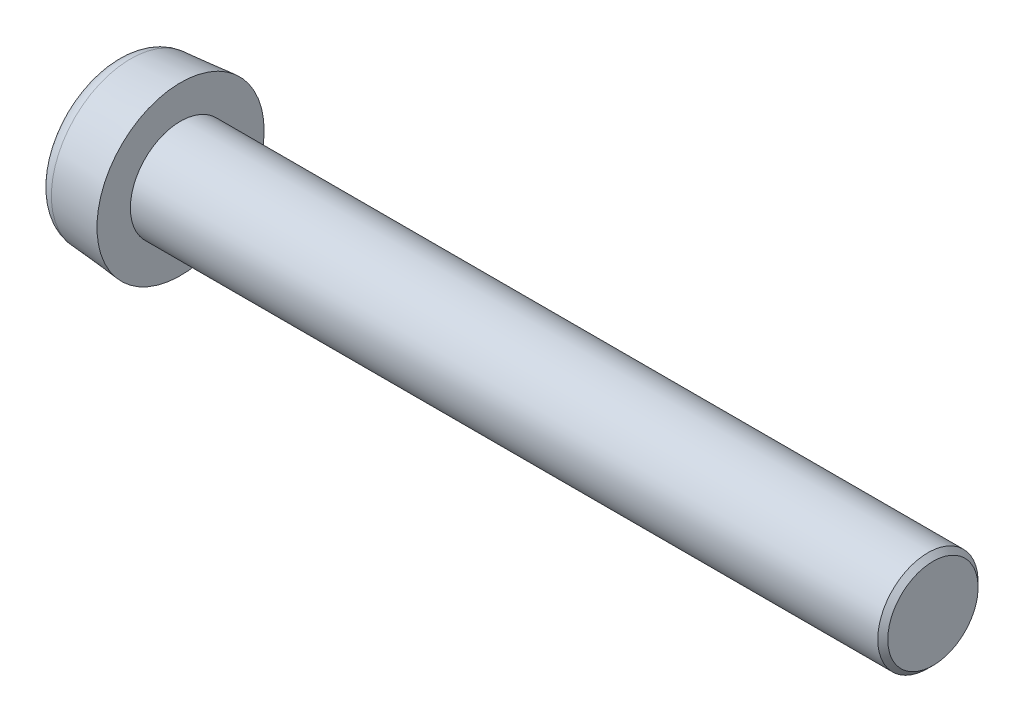
ISO-10303-21;
HEADER;
FILE_DESCRIPTION(('STEP AP214'),'2;1');
FILE_NAME('part.step','',(''),(''),'','','');
FILE_SCHEMA(('AUTOMOTIVE_DESIGN { 1 0 10303 214 1 1 1 1 }'));
ENDSEC;
DATA;
#1=APPLICATION_CONTEXT('core data for automotive mechanical design processes');
#2=APPLICATION_PROTOCOL_DEFINITION('international standard','automotive_design',2000,#1);
#3=PRODUCT_CONTEXT('',#1,'mechanical');
#4=PRODUCT('Part','Part','',(#3));
#5=PRODUCT_RELATED_PRODUCT_CATEGORY('part','',(#4));
#6=PRODUCT_DEFINITION_FORMATION('','',#4);
#7=PRODUCT_DEFINITION_CONTEXT('part definition',#1,'design');
#8=PRODUCT_DEFINITION('design','',#6,#7);
#9=PRODUCT_DEFINITION_SHAPE('','',#8);
#10=(LENGTH_UNIT() NAMED_UNIT(*) SI_UNIT(.MILLI.,.METRE.));
#11=(NAMED_UNIT(*) PLANE_ANGLE_UNIT() SI_UNIT($,.RADIAN.));
#12=(NAMED_UNIT(*) SI_UNIT($,.STERADIAN.) SOLID_ANGLE_UNIT());
#13=UNCERTAINTY_MEASURE_WITH_UNIT(LENGTH_MEASURE(1.E-05),#10,'distance_accuracy_value','');
#14=(GEOMETRIC_REPRESENTATION_CONTEXT(3) GLOBAL_UNCERTAINTY_ASSIGNED_CONTEXT((#13)) GLOBAL_UNIT_ASSIGNED_CONTEXT((#10,
#11,#12)) REPRESENTATION_CONTEXT('',''));
#15=CARTESIAN_POINT('',(0.,0.,0.));
#16=DIRECTION('',(0.,0.,1.));
#17=DIRECTION('',(1.,0.,0.));
#18=AXIS2_PLACEMENT_3D('',#15,#16,#17);
#19=CARTESIAN_POINT('',(0.,0.,0.));
#20=DIRECTION('',(1.,0.,0.));
#21=DIRECTION('',(0.,0.,-1.));
#22=AXIS2_PLACEMENT_3D('',#19,#20,#21);
#23=PLANE('',#22);
#24=CARTESIAN_POINT('',(0.,0.,0.));
#25=DIRECTION('',(1.,0.,0.));
#26=DIRECTION('',(0.,0.,-1.));
#27=AXIS2_PLACEMENT_3D('',#24,#25,#26);
#28=CIRCLE('',#27,3.74246303823147);
#29=CARTESIAN_POINT('',(0.,0.,-3.74246303823147));
#30=VERTEX_POINT('',#29);
#31=EDGE_CURVE('E138',#30,#30,#28,.F.);
#32=ORIENTED_EDGE('',*,*,#31,.T.);
#33=EDGE_LOOP('',(#32));
#34=FACE_BOUND('',#33,.T.);
#35=DIRECTION('',(0.,0.866025403784439,-0.5));
#36=VECTOR('',#35,1.);
#37=CARTESIAN_POINT('',(0.,-2.075,-1.19800180856848));
#38=LINE('',#37,#36);
#39=CARTESIAN_POINT('',(0.,-2.075,-1.19800180856848));
#40=VERTEX_POINT('',#39);
#41=CARTESIAN_POINT('',(0.,0.,-2.39600361713695));
#42=VERTEX_POINT('',#41);
#43=EDGE_CURVE('E54',#40,#42,#38,.T.);
#44=ORIENTED_EDGE('',*,*,#43,.T.);
#45=DIRECTION('',(0.,0.866025403784438,0.5));
#46=VECTOR('',#45,1.);
#47=CARTESIAN_POINT('',(0.,0.,-2.39600361713695));
#48=LINE('',#47,#46);
#49=CARTESIAN_POINT('',(0.,2.075,-1.19800180856847));
#50=VERTEX_POINT('',#49);
#51=EDGE_CURVE('E113',#42,#50,#48,.T.);
#52=ORIENTED_EDGE('',*,*,#51,.T.);
#53=DIRECTION('',(0.,0.,1.));
#54=VECTOR('',#53,1.);
#55=CARTESIAN_POINT('',(0.,2.075,-1.19800180856847));
#56=LINE('',#55,#54);
#57=CARTESIAN_POINT('',(0.,2.075,1.19800180856847));
#58=VERTEX_POINT('',#57);
#59=EDGE_CURVE('E111',#50,#58,#56,.T.);
#60=ORIENTED_EDGE('',*,*,#59,.T.);
#61=DIRECTION('',(0.,-0.866025403784438,0.5));
#62=VECTOR('',#61,1.);
#63=CARTESIAN_POINT('',(0.,2.075,1.19800180856847));
#64=LINE('',#63,#62);
#65=CARTESIAN_POINT('',(0.,0.,2.39600361713695));
#66=VERTEX_POINT('',#65);
#67=EDGE_CURVE('E90',#58,#66,#64,.T.);
#68=ORIENTED_EDGE('',*,*,#67,.T.);
#69=DIRECTION('',(0.,-0.866025403784438,-0.5));
#70=VECTOR('',#69,1.);
#71=CARTESIAN_POINT('',(0.,0.,2.39600361713695));
#72=LINE('',#71,#70);
#73=CARTESIAN_POINT('',(0.,-2.075,1.19800180856847));
#74=VERTEX_POINT('',#73);
#75=EDGE_CURVE('E101',#66,#74,#72,.T.);
#76=ORIENTED_EDGE('',*,*,#75,.T.);
#77=DIRECTION('',(0.,0.,-1.));
#78=VECTOR('',#77,1.);
#79=CARTESIAN_POINT('',(0.,-2.075,1.19800180856847));
#80=LINE('',#79,#78);
#81=EDGE_CURVE('E107',#74,#40,#80,.T.);
#82=ORIENTED_EDGE('',*,*,#81,.T.);
#83=EDGE_LOOP('',(#44,#52,#60,#68,#76,#82));
#84=FACE_BOUND('',#83,.T.);
#85=ADVANCED_FACE('F39',(#34,#84),#23,.F.);
#86=CARTESIAN_POINT('',(3.9,0.,0.));
#87=DIRECTION('',(1.,0.,0.));
#88=DIRECTION('',(0.,0.,-1.));
#89=AXIS2_PLACEMENT_3D('',#86,#87,#88);
#90=PLANE('',#89);
#91=CARTESIAN_POINT('',(3.9,0.,0.));
#92=DIRECTION('',(1.,0.,0.));
#93=DIRECTION('',(0.,0.,-1.));
#94=AXIS2_PLACEMENT_3D('',#91,#92,#93);
#95=CIRCLE('',#94,5.);
#96=CARTESIAN_POINT('',(3.9,0.,-5.));
#97=VERTEX_POINT('',#96);
#98=EDGE_CURVE('E131',#97,#97,#95,.T.);
#99=ORIENTED_EDGE('',*,*,#98,.T.);
#100=EDGE_LOOP('',(#99));
#101=FACE_BOUND('',#100,.T.);
#102=CARTESIAN_POINT('',(3.9,0.,0.));
#103=DIRECTION('',(1.,0.,0.));
#104=DIRECTION('',(0.,0.,-1.));
#105=AXIS2_PLACEMENT_3D('',#102,#103,#104);
#106=CIRCLE('',#105,3.);
#107=CARTESIAN_POINT('',(3.89999999999999,0.,3.));
#108=VERTEX_POINT('',#107);
#109=EDGE_CURVE('E128',#108,#108,#106,.T.);
#110=ORIENTED_EDGE('',*,*,#109,.F.);
#111=EDGE_LOOP('',(#110));
#112=FACE_BOUND('',#111,.T.);
#113=ADVANCED_FACE('F155',(#101,#112),#90,.T.);
#114=CARTESIAN_POINT('',(3.9,0.,0.));
#115=DIRECTION('',(1.,0.,0.));
#116=DIRECTION('',(0.,0.,-1.));
#117=AXIS2_PLACEMENT_3D('',#114,#115,#116);
#118=CONICAL_SURFACE('',#117,5.,0.0872664625997167);
#119=CARTESIAN_POINT('',(0.912844257252342,0.,0.));
#120=DIRECTION('',(1.,0.,0.));
#121=DIRECTION('',(0.,0.,-1.));
#122=AXIS2_PLACEMENT_3D('',#119,#120,#121);
#123=CIRCLE('',#122,4.73865773632322);
#124=CARTESIAN_POINT('',(0.912844257252342,0.,-4.73865773632322));
#125=VERTEX_POINT('',#124);
#126=EDGE_CURVE('E135',#125,#125,#123,.T.);
#127=ORIENTED_EDGE('',*,*,#126,.T.);
#128=EDGE_LOOP('',(#127));
#129=FACE_BOUND('',#128,.T.);
#130=ORIENTED_EDGE('',*,*,#98,.F.);
#131=EDGE_LOOP('',(#130));
#132=FACE_BOUND('',#131,.T.);
#133=ADVANCED_FACE('F161',(#129,#132),#118,.T.);
#134=CARTESIAN_POINT('',(48.9,0.,0.));
#135=DIRECTION('',(-1.,0.,0.));
#136=DIRECTION('',(0.,0.,1.));
#137=AXIS2_PLACEMENT_3D('',#134,#135,#136);
#138=CYLINDRICAL_SURFACE('',#137,3.);
#139=CARTESIAN_POINT('',(48.6,0.,0.));
#140=DIRECTION('',(1.,0.,0.));
#141=DIRECTION('',(0.,0.,-1.));
#142=AXIS2_PLACEMENT_3D('',#139,#140,#141);
#143=CIRCLE('',#142,3.);
#144=CARTESIAN_POINT('',(48.6,0.,3.));
#145=VERTEX_POINT('',#144);
#146=EDGE_CURVE('E11',#145,#145,#143,.F.);
#147=CARTESIAN_POINT('',(48.6,0.,3.));
#148=CARTESIAN_POINT('',(48.134375,0.,3.));
#149=CARTESIAN_POINT('',(47.66875,0.,3.));
#150=CARTESIAN_POINT('',(46.7375,0.,3.));
#151=CARTESIAN_POINT('',(46.271875,0.,3.));
#152=CARTESIAN_POINT('',(45.340625,0.,3.));
#153=CARTESIAN_POINT('',(44.875,0.,3.));
#154=CARTESIAN_POINT('',(43.94375,0.,3.));
#155=CARTESIAN_POINT('',(43.478125,0.,3.));
#156=CARTESIAN_POINT('',(42.546875,0.,3.));
#157=CARTESIAN_POINT('',(42.08125,0.,3.));
#158=CARTESIAN_POINT('',(41.15,0.,3.));
#159=CARTESIAN_POINT('',(40.684375,0.,3.));
#160=CARTESIAN_POINT('',(39.753125,0.,3.));
#161=CARTESIAN_POINT('',(39.2875,0.,3.));
#162=CARTESIAN_POINT('',(38.35625,0.,3.));
#163=CARTESIAN_POINT('',(37.890625,0.,3.));
#164=CARTESIAN_POINT('',(36.959375,0.,3.));
#165=CARTESIAN_POINT('',(36.49375,0.,3.));
#166=CARTESIAN_POINT('',(35.5625,0.,3.));
#167=CARTESIAN_POINT('',(35.096875,0.,3.));
#168=CARTESIAN_POINT('',(34.165625,0.,3.));
#169=CARTESIAN_POINT('',(33.7,0.,3.));
#170=CARTESIAN_POINT('',(32.76875,0.,3.));
#171=CARTESIAN_POINT('',(32.303125,0.,3.));
#172=CARTESIAN_POINT('',(31.371875,0.,3.));
#173=CARTESIAN_POINT('',(30.90625,0.,3.));
#174=CARTESIAN_POINT('',(29.975,0.,3.));
#175=CARTESIAN_POINT('',(29.509375,0.,3.));
#176=CARTESIAN_POINT('',(28.578125,0.,3.));
#177=CARTESIAN_POINT('',(28.1125,0.,3.));
#178=CARTESIAN_POINT('',(27.18125,0.,3.));
#179=CARTESIAN_POINT('',(26.715625,0.,3.));
#180=CARTESIAN_POINT('',(25.784375,0.,3.));
#181=CARTESIAN_POINT('',(25.31875,0.,3.));
#182=CARTESIAN_POINT('',(24.3875,0.,3.));
#183=CARTESIAN_POINT('',(23.921875,0.,3.));
#184=CARTESIAN_POINT('',(22.990625,0.,3.));
#185=CARTESIAN_POINT('',(22.525,0.,3.));
#186=CARTESIAN_POINT('',(21.59375,0.,3.));
#187=CARTESIAN_POINT('',(21.128125,0.,3.));
#188=CARTESIAN_POINT('',(20.196875,0.,3.));
#189=CARTESIAN_POINT('',(19.73125,0.,3.));
#190=CARTESIAN_POINT('',(18.8,0.,3.));
#191=CARTESIAN_POINT('',(18.334375,0.,3.));
#192=CARTESIAN_POINT('',(17.403125,0.,3.));
#193=CARTESIAN_POINT('',(16.9375,0.,3.));
#194=CARTESIAN_POINT('',(16.00625,0.,3.));
#195=CARTESIAN_POINT('',(15.540625,0.,3.));
#196=CARTESIAN_POINT('',(14.609375,0.,3.));
#197=CARTESIAN_POINT('',(14.14375,0.,3.));
#198=CARTESIAN_POINT('',(13.2125,0.,3.));
#199=CARTESIAN_POINT('',(12.746875,0.,3.));
#200=CARTESIAN_POINT('',(11.815625,0.,3.));
#201=CARTESIAN_POINT('',(11.35,0.,3.));
#202=CARTESIAN_POINT('',(10.41875,0.,3.));
#203=CARTESIAN_POINT('',(9.95312500000001,0.,3.));
#204=CARTESIAN_POINT('',(9.021875,0.,3.));
#205=CARTESIAN_POINT('',(8.55625,0.,3.));
#206=CARTESIAN_POINT('',(7.625,0.,3.));
#207=CARTESIAN_POINT('',(7.159375,0.,3.));
#208=CARTESIAN_POINT('',(6.228125,0.,3.));
#209=CARTESIAN_POINT('',(5.7625,0.,3.));
#210=CARTESIAN_POINT('',(4.83125,0.,3.));
#211=CARTESIAN_POINT('',(4.365625,0.,3.));
#212=CARTESIAN_POINT('',(3.89999999999999,0.,3.));
#213=B_SPLINE_CURVE_WITH_KNOTS('',3,(#147,#148,#149,#150,#151,#152,#153,#154,#155,#156,#157,
#158,#159,#160,#161,#162,#163,#164,#165,#166,#167,#168,#169,#170,#171,#172,#173,#174,#175,#176,
#177,#178,#179,#180,#181,#182,#183,#184,#185,#186,#187,#188,#189,#190,#191,#192,#193,#194,#195,
#196,#197,#198,#199,#200,#201,#202,#203,#204,#205,#206,#207,#208,#209,#210,#211,#212),
.UNSPECIFIED.,.F.,.F.,(4,2,2,2,2,2,2,2,2,2,2,2,2,2,2,2,2,2,2,2,2,2,2,2,2,2,2,2,2,2,2,2,4),(0.,
1.39687500000001,2.79375,4.190625,5.58750000000001,6.98437500000001,8.38125000000001,
9.77812500000001,11.175,12.571875,13.96875,15.365625,16.7625,18.159375,19.55625,20.953125,22.35,
23.746875,25.14375,26.540625,27.9375,29.334375,30.73125,32.128125,33.525,34.921875,36.31875,
37.715625,39.1125,40.509375,41.90625,43.303125,44.7),.UNSPECIFIED.);
#214=EDGE_CURVE('BSEAM165',#145,#108,#213,.T.);
#215=ORIENTED_EDGE('',*,*,#146,.T.);
#216=ORIENTED_EDGE('',*,*,#109,.T.);
#217=ORIENTED_EDGE('',*,*,#214,.T.);
#218=ORIENTED_EDGE('',*,*,#214,.F.);
#219=EDGE_LOOP('',(#215,#217,#216,#218));
#220=FACE_BOUND('',#219,.T.);
#221=ADVANCED_FACE('F165',(#220),#138,.T.);
#222=CARTESIAN_POINT('',(48.9,0.,0.));
#223=DIRECTION('',(1.,0.,0.));
#224=DIRECTION('',(0.,0.,-1.));
#225=AXIS2_PLACEMENT_3D('',#222,#223,#224);
#226=PLANE('',#225);
#227=CARTESIAN_POINT('',(48.9,0.,0.));
#228=DIRECTION('',(1.,0.,0.));
#229=DIRECTION('',(0.,0.,-1.));
#230=AXIS2_PLACEMENT_3D('',#227,#228,#229);
#231=CIRCLE('',#230,2.70000000000003);
#232=CARTESIAN_POINT('',(48.9,0.,2.70000000000003));
#233=VERTEX_POINT('',#232);
#234=EDGE_CURVE('E47',#233,#233,#231,.T.);
#235=ORIENTED_EDGE('',*,*,#234,.T.);
#236=EDGE_LOOP('',(#235));
#237=FACE_BOUND('',#236,.T.);
#238=ADVANCED_FACE('F143',(#237),#226,.T.);
#239=CARTESIAN_POINT('',(2.,-2.075,-1.19800180856848));
#240=DIRECTION('',(0.,0.5,0.866025403784439));
#241=DIRECTION('',(0.,-0.866025403784439,0.5));
#242=AXIS2_PLACEMENT_3D('',#239,#240,#241);
#243=PLANE('',#242);
#244=ORIENTED_EDGE('',*,*,#43,.F.);
#245=DIRECTION('',(-1.,0.,0.));
#246=VECTOR('',#245,1.);
#247=CARTESIAN_POINT('',(2.,-2.075,-1.19800180856848));
#248=LINE('',#247,#246);
#249=CARTESIAN_POINT('',(2.,-2.075,-1.19800180856848));
#250=VERTEX_POINT('',#249);
#251=EDGE_CURVE('E119',#250,#40,#248,.T.);
#252=ORIENTED_EDGE('',*,*,#251,.F.);
#253=DIRECTION('',(0.,0.866025403784439,-0.5));
#254=VECTOR('',#253,1.);
#255=CARTESIAN_POINT('',(2.,-2.075,-1.19800180856848));
#256=LINE('',#255,#254);
#257=CARTESIAN_POINT('',(2.,0.,-2.39600361713695));
#258=VERTEX_POINT('',#257);
#259=EDGE_CURVE('E118',#250,#258,#256,.T.);
#260=ORIENTED_EDGE('',*,*,#259,.T.);
#261=DIRECTION('',(-1.,0.,0.));
#262=VECTOR('',#261,1.);
#263=CARTESIAN_POINT('',(2.,0.,-2.39600361713695));
#264=LINE('',#263,#262);
#265=EDGE_CURVE('E126',#258,#42,#264,.T.);
#266=ORIENTED_EDGE('',*,*,#265,.T.);
#267=EDGE_LOOP('',(#244,#252,#260,#266));
#268=FACE_BOUND('',#267,.T.);
#269=ADVANCED_FACE('F184',(#268),#243,.T.);
#270=CARTESIAN_POINT('',(2.,0.,-2.39600361713695));
#271=DIRECTION('',(0.,-0.5,0.866025403784438));
#272=DIRECTION('',(0.,-0.866025403784438,-0.5));
#273=AXIS2_PLACEMENT_3D('',#270,#271,#272);
#274=PLANE('',#273);
#275=ORIENTED_EDGE('',*,*,#51,.F.);
#276=ORIENTED_EDGE('',*,*,#265,.F.);
#277=DIRECTION('',(0.,0.866025403784438,0.5));
#278=VECTOR('',#277,1.);
#279=CARTESIAN_POINT('',(2.,0.,-2.39600361713695));
#280=LINE('',#279,#278);
#281=CARTESIAN_POINT('',(2.,2.075,-1.19800180856847));
#282=VERTEX_POINT('',#281);
#283=EDGE_CURVE('E257',#258,#282,#280,.T.);
#284=ORIENTED_EDGE('',*,*,#283,.T.);
#285=DIRECTION('',(-1.,0.,0.));
#286=VECTOR('',#285,1.);
#287=CARTESIAN_POINT('',(2.,2.075,-1.19800180856847));
#288=LINE('',#287,#286);
#289=EDGE_CURVE('E124',#282,#50,#288,.T.);
#290=ORIENTED_EDGE('',*,*,#289,.T.);
#291=EDGE_LOOP('',(#275,#276,#284,#290));
#292=FACE_BOUND('',#291,.T.);
#293=ADVANCED_FACE('F188',(#292),#274,.T.);
#294=CARTESIAN_POINT('',(2.,2.075,-1.19800180856847));
#295=DIRECTION('',(0.,-1.,0.));
#296=DIRECTION('',(0.,0.,-1.));
#297=AXIS2_PLACEMENT_3D('',#294,#295,#296);
#298=PLANE('',#297);
#299=ORIENTED_EDGE('',*,*,#59,.F.);
#300=ORIENTED_EDGE('',*,*,#289,.F.);
#301=DIRECTION('',(0.,0.,1.));
#302=VECTOR('',#301,1.);
#303=CARTESIAN_POINT('',(2.,2.075,-1.19800180856847));
#304=LINE('',#303,#302);
#305=CARTESIAN_POINT('',(2.,2.075,1.19800180856847));
#306=VERTEX_POINT('',#305);
#307=EDGE_CURVE('E63',#282,#306,#304,.T.);
#308=ORIENTED_EDGE('',*,*,#307,.T.);
#309=DIRECTION('',(-1.,0.,0.));
#310=VECTOR('',#309,1.);
#311=CARTESIAN_POINT('',(2.,2.075,1.19800180856847));
#312=LINE('',#311,#310);
#313=EDGE_CURVE('E97',#306,#58,#312,.T.);
#314=ORIENTED_EDGE('',*,*,#313,.T.);
#315=EDGE_LOOP('',(#299,#300,#308,#314));
#316=FACE_BOUND('',#315,.T.);
#317=ADVANCED_FACE('F193',(#316),#298,.T.);
#318=CARTESIAN_POINT('',(2.,2.075,1.19800180856847));
#319=DIRECTION('',(0.,-0.5,-0.866025403784438));
#320=DIRECTION('',(0.,0.866025403784439,-0.5));
#321=AXIS2_PLACEMENT_3D('',#318,#319,#320);
#322=PLANE('',#321);
#323=ORIENTED_EDGE('',*,*,#67,.F.);
#324=ORIENTED_EDGE('',*,*,#313,.F.);
#325=DIRECTION('',(0.,-0.866025403784438,0.5));
#326=VECTOR('',#325,1.);
#327=CARTESIAN_POINT('',(2.,2.075,1.19800180856847));
#328=LINE('',#327,#326);
#329=CARTESIAN_POINT('',(2.,0.,2.39600361713695));
#330=VERTEX_POINT('',#329);
#331=EDGE_CURVE('E94',#306,#330,#328,.T.);
#332=ORIENTED_EDGE('',*,*,#331,.T.);
#333=DIRECTION('',(-1.,0.,0.));
#334=VECTOR('',#333,1.);
#335=CARTESIAN_POINT('',(2.,0.,2.39600361713695));
#336=LINE('',#335,#334);
#337=EDGE_CURVE('E85',#330,#66,#336,.T.);
#338=ORIENTED_EDGE('',*,*,#337,.T.);
#339=EDGE_LOOP('',(#323,#324,#332,#338));
#340=FACE_BOUND('',#339,.T.);
#341=ADVANCED_FACE('F87',(#340),#322,.T.);
#342=CARTESIAN_POINT('',(2.,0.,2.39600361713695));
#343=DIRECTION('',(0.,0.5,-0.866025403784438));
#344=DIRECTION('',(0.,0.866025403784438,0.5));
#345=AXIS2_PLACEMENT_3D('',#342,#343,#344);
#346=PLANE('',#345);
#347=ORIENTED_EDGE('',*,*,#75,.F.);
#348=ORIENTED_EDGE('',*,*,#337,.F.);
#349=DIRECTION('',(0.,-0.866025403784438,-0.5));
#350=VECTOR('',#349,1.);
#351=CARTESIAN_POINT('',(2.,0.,2.39600361713695));
#352=LINE('',#351,#350);
#353=CARTESIAN_POINT('',(2.,-2.075,1.19800180856847));
#354=VERTEX_POINT('',#353);
#355=EDGE_CURVE('E232',#330,#354,#352,.T.);
#356=ORIENTED_EDGE('',*,*,#355,.T.);
#357=DIRECTION('',(-1.,0.,0.));
#358=VECTOR('',#357,1.);
#359=CARTESIAN_POINT('',(2.,-2.075,1.19800180856847));
#360=LINE('',#359,#358);
#361=EDGE_CURVE('E98',#354,#74,#360,.T.);
#362=ORIENTED_EDGE('',*,*,#361,.T.);
#363=EDGE_LOOP('',(#347,#348,#356,#362));
#364=FACE_BOUND('',#363,.T.);
#365=ADVANCED_FACE('F102',(#364),#346,.T.);
#366=CARTESIAN_POINT('',(2.,-2.075,1.19800180856847));
#367=DIRECTION('',(0.,1.,0.));
#368=DIRECTION('',(0.,0.,1.));
#369=AXIS2_PLACEMENT_3D('',#366,#367,#368);
#370=PLANE('',#369);
#371=ORIENTED_EDGE('',*,*,#81,.F.);
#372=ORIENTED_EDGE('',*,*,#361,.F.);
#373=DIRECTION('',(0.,0.,-1.));
#374=VECTOR('',#373,1.);
#375=CARTESIAN_POINT('',(2.,-2.075,1.19800180856847));
#376=LINE('',#375,#374);
#377=EDGE_CURVE('E121',#354,#250,#376,.T.);
#378=ORIENTED_EDGE('',*,*,#377,.T.);
#379=ORIENTED_EDGE('',*,*,#251,.T.);
#380=EDGE_LOOP('',(#371,#372,#378,#379));
#381=FACE_BOUND('',#380,.T.);
#382=ADVANCED_FACE('F202',(#381),#370,.T.);
#383=CARTESIAN_POINT('',(2.,0.,2.39600361713695));
#384=DIRECTION('',(0.86602540378444,-0.249999999999999,0.433012701892218));
#385=DIRECTION('',(0.447213595499956,0.,-0.894427190999917));
#386=AXIS2_PLACEMENT_3D('',#383,#384,#385);
#387=PLANE('',#386);
#388=ORIENTED_EDGE('',*,*,#355,.F.);
#389=DIRECTION('',(-0.447213595499956,0.,0.894427190999917));
#390=VECTOR('',#389,1.);
#391=CARTESIAN_POINT('',(2.,0.,2.39600361713695));
#392=LINE('',#391,#390);
#393=CARTESIAN_POINT('',(3.19800180856847,0.,0.));
#394=VERTEX_POINT('',#393);
#395=EDGE_CURVE('E234',#394,#330,#392,.T.);
#396=ORIENTED_EDGE('',*,*,#395,.F.);
#397=DIRECTION('',(-0.447213595499956,-0.774596669241484,0.447213595499958));
#398=VECTOR('',#397,1.);
#399=CARTESIAN_POINT('',(2.,-2.075,1.19800180856847));
#400=LINE('',#399,#398);
#401=EDGE_CURVE('E237',#394,#354,#400,.T.);
#402=ORIENTED_EDGE('',*,*,#401,.T.);
#403=EDGE_LOOP('',(#388,#396,#402));
#404=FACE_BOUND('',#403,.T.);
#405=ADVANCED_FACE('F205',(#404),#387,.F.);
#406=CARTESIAN_POINT('',(2.,-2.075,1.19800180856847));
#407=DIRECTION('',(0.86602540378444,-0.499999999999998,0.));
#408=DIRECTION('',(0.499999999999998,0.86602540378444,0.));
#409=AXIS2_PLACEMENT_3D('',#406,#407,#408);
#410=PLANE('',#409);
#411=ORIENTED_EDGE('',*,*,#377,.F.);
#412=ORIENTED_EDGE('',*,*,#401,.F.);
#413=DIRECTION('',(-0.447213595499956,-0.774596669241484,-0.447213595499958));
#414=VECTOR('',#413,1.);
#415=CARTESIAN_POINT('',(2.,-2.075,-1.19800180856848));
#416=LINE('',#415,#414);
#417=EDGE_CURVE('E261',#394,#250,#416,.T.);
#418=ORIENTED_EDGE('',*,*,#417,.T.);
#419=EDGE_LOOP('',(#411,#412,#418));
#420=FACE_BOUND('',#419,.T.);
#421=ADVANCED_FACE('F207',(#420),#410,.F.);
#422=CARTESIAN_POINT('',(2.,-2.075,-1.19800180856848));
#423=DIRECTION('',(0.86602540378444,-0.249999999999999,-0.433012701892218));
#424=DIRECTION('',(-0.447213595499956,0.,-0.894427190999917));
#425=AXIS2_PLACEMENT_3D('',#422,#423,#424);
#426=PLANE('',#425);
#427=ORIENTED_EDGE('',*,*,#259,.F.);
#428=ORIENTED_EDGE('',*,*,#417,.F.);
#429=DIRECTION('',(-0.447213595499956,0.,-0.894427190999917));
#430=VECTOR('',#429,1.);
#431=CARTESIAN_POINT('',(2.,0.,-2.39600361713695));
#432=LINE('',#431,#430);
#433=EDGE_CURVE('E269',#394,#258,#432,.T.);
#434=ORIENTED_EDGE('',*,*,#433,.T.);
#435=EDGE_LOOP('',(#427,#428,#434));
#436=FACE_BOUND('',#435,.T.);
#437=ADVANCED_FACE('F210',(#436),#426,.F.);
#438=CARTESIAN_POINT('',(2.,0.,-2.39600361713695));
#439=DIRECTION('',(0.86602540378444,0.249999999999999,-0.433012701892218));
#440=DIRECTION('',(-0.447213595499956,0.,-0.894427190999917));
#441=AXIS2_PLACEMENT_3D('',#438,#439,#440);
#442=PLANE('',#441);
#443=ORIENTED_EDGE('',*,*,#283,.F.);
#444=ORIENTED_EDGE('',*,*,#433,.F.);
#445=DIRECTION('',(-0.447213595499956,0.774596669241484,-0.447213595499958));
#446=VECTOR('',#445,1.);
#447=CARTESIAN_POINT('',(2.,2.075,-1.19800180856847));
#448=LINE('',#447,#446);
#449=EDGE_CURVE('E271',#394,#282,#448,.T.);
#450=ORIENTED_EDGE('',*,*,#449,.T.);
#451=EDGE_LOOP('',(#443,#444,#450));
#452=FACE_BOUND('',#451,.T.);
#453=ADVANCED_FACE('F214',(#452),#442,.F.);
#454=CARTESIAN_POINT('',(2.,2.075,-1.19800180856847));
#455=DIRECTION('',(0.86602540378444,0.499999999999998,0.));
#456=DIRECTION('',(-0.499999999999998,0.86602540378444,0.));
#457=AXIS2_PLACEMENT_3D('',#454,#455,#456);
#458=PLANE('',#457);
#459=ORIENTED_EDGE('',*,*,#307,.F.);
#460=ORIENTED_EDGE('',*,*,#449,.F.);
#461=DIRECTION('',(-0.447213595499956,0.774596669241484,0.447213595499958));
#462=VECTOR('',#461,1.);
#463=CARTESIAN_POINT('',(2.,2.075,1.19800180856847));
#464=LINE('',#463,#462);
#465=EDGE_CURVE('E265',#394,#306,#464,.T.);
#466=ORIENTED_EDGE('',*,*,#465,.T.);
#467=EDGE_LOOP('',(#459,#460,#466));
#468=FACE_BOUND('',#467,.T.);
#469=ADVANCED_FACE('F218',(#468),#458,.F.);
#470=CARTESIAN_POINT('',(2.,2.075,1.19800180856847));
#471=DIRECTION('',(0.86602540378444,0.249999999999999,0.433012701892218));
#472=DIRECTION('',(0.447213595499956,0.,-0.894427190999917));
#473=AXIS2_PLACEMENT_3D('',#470,#471,#472);
#474=PLANE('',#473);
#475=ORIENTED_EDGE('',*,*,#331,.F.);
#476=ORIENTED_EDGE('',*,*,#465,.F.);
#477=ORIENTED_EDGE('',*,*,#395,.T.);
#478=EDGE_LOOP('',(#475,#476,#477));
#479=FACE_BOUND('',#478,.T.);
#480=ADVANCED_FACE('F151',(#479),#474,.F.);
#481=CARTESIAN_POINT('',(1.,0.,0.));
#482=DIRECTION('',(1.,0.,0.));
#483=DIRECTION('',(0.,0.,-1.));
#484=AXIS2_PLACEMENT_3D('',#481,#482,#483);
#485=TOROIDAL_SURFACE('',#484,3.74246303823147,1.);
#486=ORIENTED_EDGE('',*,*,#31,.F.);
#487=EDGE_LOOP('',(#486));
#488=FACE_BOUND('',#487,.T.);
#489=ORIENTED_EDGE('',*,*,#126,.F.);
#490=EDGE_LOOP('',(#489));
#491=FACE_BOUND('',#490,.T.);
#492=ADVANCED_FACE('F146',(#488,#491),#485,.T.);
#493=CARTESIAN_POINT('',(48.9,0.,0.));
#494=DIRECTION('',(-1.,0.,0.));
#495=DIRECTION('',(0.,0.,1.));
#496=AXIS2_PLACEMENT_3D('',#493,#494,#495);
#497=CONICAL_SURFACE('',#496,2.70000000000003,0.785398163397445);
#498=CARTESIAN_POINT('',(48.6,0.,3.));
#499=CARTESIAN_POINT('',(48.603125,0.,2.996875));
#500=CARTESIAN_POINT('',(48.60625,0.,2.99375));
#501=CARTESIAN_POINT('',(48.6125,0.,2.98750000000001));
#502=CARTESIAN_POINT('',(48.615625,0.,2.98437500000001));
#503=CARTESIAN_POINT('',(48.621875,0.,2.97812500000001));
#504=CARTESIAN_POINT('',(48.625,0.,2.97500000000001));
#505=CARTESIAN_POINT('',(48.63125,0.,2.96875000000001));
#506=CARTESIAN_POINT('',(48.634375,0.,2.96562500000001));
#507=CARTESIAN_POINT('',(48.640625,0.,2.95937500000001));
#508=CARTESIAN_POINT('',(48.64375,0.,2.95625000000001));
#509=CARTESIAN_POINT('',(48.65,0.,2.95000000000001));
#510=CARTESIAN_POINT('',(48.653125,0.,2.94687500000001));
#511=CARTESIAN_POINT('',(48.659375,0.,2.94062500000001));
#512=CARTESIAN_POINT('',(48.6625,0.,2.93750000000001));
#513=CARTESIAN_POINT('',(48.66875,0.,2.93125000000001));
#514=CARTESIAN_POINT('',(48.671875,0.,2.92812500000001));
#515=CARTESIAN_POINT('',(48.678125,0.,2.92187500000001));
#516=CARTESIAN_POINT('',(48.68125,0.,2.91875000000001));
#517=CARTESIAN_POINT('',(48.6875,0.,2.91250000000001));
#518=CARTESIAN_POINT('',(48.690625,0.,2.90937500000001));
#519=CARTESIAN_POINT('',(48.696875,0.,2.90312500000001));
#520=CARTESIAN_POINT('',(48.7,0.,2.90000000000001));
#521=CARTESIAN_POINT('',(48.70625,0.,2.89375000000001));
#522=CARTESIAN_POINT('',(48.709375,0.,2.89062500000001));
#523=CARTESIAN_POINT('',(48.715625,0.,2.88437500000001));
#524=CARTESIAN_POINT('',(48.71875,0.,2.88125000000001));
#525=CARTESIAN_POINT('',(48.725,0.,2.87500000000002));
#526=CARTESIAN_POINT('',(48.728125,0.,2.87187500000002));
#527=CARTESIAN_POINT('',(48.734375,0.,2.86562500000002));
#528=CARTESIAN_POINT('',(48.7375,0.,2.86250000000002));
#529=CARTESIAN_POINT('',(48.74375,0.,2.85625000000002));
#530=CARTESIAN_POINT('',(48.746875,0.,2.85312500000002));
#531=CARTESIAN_POINT('',(48.753125,0.,2.84687500000002));
#532=CARTESIAN_POINT('',(48.75625,0.,2.84375000000002));
#533=CARTESIAN_POINT('',(48.7625,0.,2.83750000000002));
#534=CARTESIAN_POINT('',(48.765625,0.,2.83437500000002));
#535=CARTESIAN_POINT('',(48.771875,0.,2.82812500000002));
#536=CARTESIAN_POINT('',(48.775,0.,2.82500000000002));
#537=CARTESIAN_POINT('',(48.78125,0.,2.81875000000002));
#538=CARTESIAN_POINT('',(48.784375,0.,2.81562500000002));
#539=CARTESIAN_POINT('',(48.790625,0.,2.80937500000002));
#540=CARTESIAN_POINT('',(48.79375,0.,2.80625000000002));
#541=CARTESIAN_POINT('',(48.8,0.,2.80000000000002));
#542=CARTESIAN_POINT('',(48.803125,0.,2.79687500000002));
#543=CARTESIAN_POINT('',(48.809375,0.,2.79062500000002));
#544=CARTESIAN_POINT('',(48.8125,0.,2.78750000000002));
#545=CARTESIAN_POINT('',(48.81875,0.,2.78125000000002));
#546=CARTESIAN_POINT('',(48.821875,0.,2.77812500000002));
#547=CARTESIAN_POINT('',(48.828125,0.,2.77187500000003));
#548=CARTESIAN_POINT('',(48.83125,0.,2.76875000000003));
#549=CARTESIAN_POINT('',(48.8375,0.,2.76250000000003));
#550=CARTESIAN_POINT('',(48.840625,0.,2.75937500000003));
#551=CARTESIAN_POINT('',(48.846875,0.,2.75312500000003));
#552=CARTESIAN_POINT('',(48.85,0.,2.75000000000003));
#553=CARTESIAN_POINT('',(48.85625,0.,2.74375000000003));
#554=CARTESIAN_POINT('',(48.859375,0.,2.74062500000003));
#555=CARTESIAN_POINT('',(48.865625,0.,2.73437500000003));
#556=CARTESIAN_POINT('',(48.86875,0.,2.73125000000003));
#557=CARTESIAN_POINT('',(48.875,0.,2.72500000000003));
#558=CARTESIAN_POINT('',(48.878125,0.,2.72187500000003));
#559=CARTESIAN_POINT('',(48.884375,0.,2.71562500000003));
#560=CARTESIAN_POINT('',(48.8875,0.,2.71250000000003));
#561=CARTESIAN_POINT('',(48.89375,0.,2.70625000000003));
#562=CARTESIAN_POINT('',(48.896875,0.,2.70312500000003));
#563=CARTESIAN_POINT('',(48.9,0.,2.70000000000003));
#564=B_SPLINE_CURVE_WITH_KNOTS('',3,(#498,#499,#500,#501,#502,#503,#504,#505,#506,#507,#508,
#509,#510,#511,#512,#513,#514,#515,#516,#517,#518,#519,#520,#521,#522,#523,#524,#525,#526,#527,
#528,#529,#530,#531,#532,#533,#534,#535,#536,#537,#538,#539,#540,#541,#542,#543,#544,#545,#546,
#547,#548,#549,#550,#551,#552,#553,#554,#555,#556,#557,#558,#559,#560,#561,#562,#563),
.UNSPECIFIED.,.F.,.F.,(4,2,2,2,2,2,2,2,2,2,2,2,2,2,2,2,2,2,2,2,2,2,2,2,2,2,2,2,2,2,2,2,4),(0.,
0.0132582521472463,0.0265165042944929,0.0397747564417392,0.0530330085889855,0.0662912607362321,
0.0795495128834784,0.0928077650307251,0.106066017177971,0.119324269325218,0.132582521472464,
0.145840773619711,0.159099025766957,0.172357277914203,0.18561553006145,0.198873782208696,
0.212132034355943,0.225390286503189,0.238648538650436,0.251906790797682,0.265165042944928,
0.278423295092175,0.291681547239421,0.304939799386668,0.318198051533914,0.33145630368116,
0.344714555828407,0.357972807975653,0.3712310601229,0.384489312270146,0.397747564417393,
0.411005816564639,0.42426406871189),.UNSPECIFIED.);
#565=EDGE_CURVE('BSEAM41',#145,#233,#564,.T.);
#566=ORIENTED_EDGE('',*,*,#146,.F.);
#567=ORIENTED_EDGE('',*,*,#234,.F.);
#568=ORIENTED_EDGE('',*,*,#565,.T.);
#569=ORIENTED_EDGE('',*,*,#565,.F.);
#570=EDGE_LOOP('',(#566,#568,#567,#569));
#571=FACE_BOUND('',#570,.T.);
#572=ADVANCED_FACE('F41',(#571),#497,.T.);
#573=CLOSED_SHELL('',(#85,#113,#133,#221,#238,#269,#293,#317,#341,#365,#382,#405,#421,#437,#453,
#469,#480,#492,#572));
#574=MANIFOLD_SOLID_BREP('B2',#573);
#575=ADVANCED_BREP_SHAPE_REPRESENTATION('',(#18,#574),#14);
#576=SHAPE_DEFINITION_REPRESENTATION(#9,#575);
ENDSEC;
END-ISO-10303-21;
